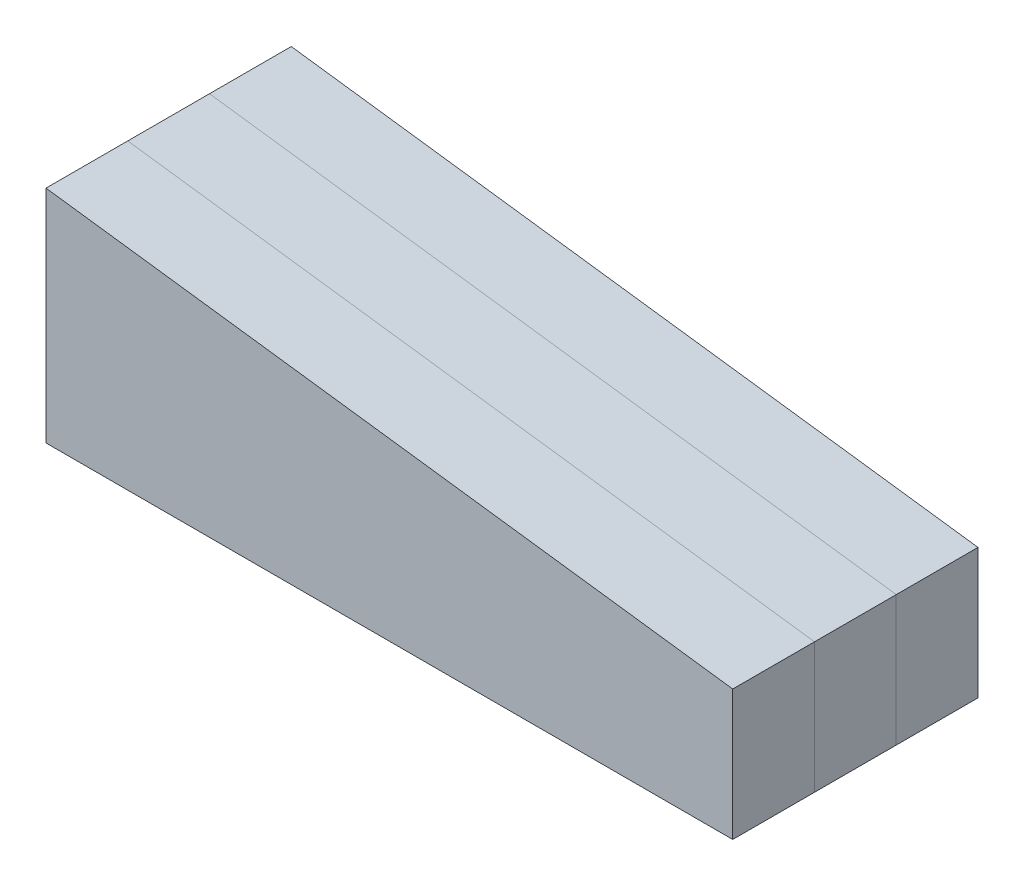
ISO-10303-21;
HEADER;
FILE_DESCRIPTION(('STEP AP214'),'2;1');
FILE_NAME('part.step','',(''),(''),'','','');
FILE_SCHEMA(('AUTOMOTIVE_DESIGN { 1 0 10303 214 1 1 1 1 }'));
ENDSEC;
DATA;
#1=APPLICATION_CONTEXT('core data for automotive mechanical design processes');
#2=APPLICATION_PROTOCOL_DEFINITION('international standard','automotive_design',2000,#1);
#3=PRODUCT_CONTEXT('',#1,'mechanical');
#4=PRODUCT('Part','Part','',(#3));
#5=PRODUCT_RELATED_PRODUCT_CATEGORY('part','',(#4));
#6=PRODUCT_DEFINITION_FORMATION('','',#4);
#7=PRODUCT_DEFINITION_CONTEXT('part definition',#1,'design');
#8=PRODUCT_DEFINITION('design','',#6,#7);
#9=PRODUCT_DEFINITION_SHAPE('','',#8);
#10=(LENGTH_UNIT() NAMED_UNIT(*) SI_UNIT(.MILLI.,.METRE.));
#11=(NAMED_UNIT(*) PLANE_ANGLE_UNIT() SI_UNIT($,.RADIAN.));
#12=(NAMED_UNIT(*) SI_UNIT($,.STERADIAN.) SOLID_ANGLE_UNIT());
#13=UNCERTAINTY_MEASURE_WITH_UNIT(LENGTH_MEASURE(1.E-05),#10,'distance_accuracy_value','');
#14=(GEOMETRIC_REPRESENTATION_CONTEXT(3) GLOBAL_UNCERTAINTY_ASSIGNED_CONTEXT((#13)) GLOBAL_UNIT_ASSIGNED_CONTEXT((#10,
#11,#12)) REPRESENTATION_CONTEXT('',''));
#15=CARTESIAN_POINT('',(0.,0.,0.));
#16=DIRECTION('',(0.,0.,1.));
#17=DIRECTION('',(1.,0.,0.));
#18=AXIS2_PLACEMENT_3D('',#15,#16,#17);
#19=CARTESIAN_POINT('',(0.,0.,26.4583333333333));
#20=DIRECTION('',(0.,1.,0.));
#21=DIRECTION('',(-1.,0.,0.));
#22=AXIS2_PLACEMENT_3D('',#19,#20,#21);
#23=PLANE('',#22);
#24=DIRECTION('',(1.,0.,0.));
#25=VECTOR('',#24,1.);
#26=CARTESIAN_POINT('',(0.,0.,15.875));
#27=LINE('',#26,#25);
#28=CARTESIAN_POINT('',(0.,0.,15.875));
#29=VERTEX_POINT('',#28);
#30=CARTESIAN_POINT('',(88.9,0.,15.875));
#31=VERTEX_POINT('',#30);
#32=EDGE_CURVE('E113',#29,#31,#27,.T.);
#33=ORIENTED_EDGE('',*,*,#32,.T.);
#34=DIRECTION('',(0.,0.,-1.));
#35=VECTOR('',#34,1.);
#36=CARTESIAN_POINT('',(88.9,0.,26.4583333333333));
#37=LINE('',#36,#35);
#38=CARTESIAN_POINT('',(88.9,0.,26.4583333333333));
#39=VERTEX_POINT('',#38);
#40=EDGE_CURVE('E12',#39,#31,#37,.T.);
#41=ORIENTED_EDGE('',*,*,#40,.F.);
#42=DIRECTION('',(1.,0.,0.));
#43=VECTOR('',#42,1.);
#44=CARTESIAN_POINT('',(0.,0.,26.4583333333333));
#45=LINE('',#44,#43);
#46=CARTESIAN_POINT('',(0.,0.,26.4583333333333));
#47=VERTEX_POINT('',#46);
#48=EDGE_CURVE('E100',#47,#39,#45,.T.);
#49=ORIENTED_EDGE('',*,*,#48,.F.);
#50=DIRECTION('',(0.,0.,-1.));
#51=VECTOR('',#50,1.);
#52=CARTESIAN_POINT('',(0.,0.,26.4583333333333));
#53=LINE('',#52,#51);
#54=EDGE_CURVE('E109',#47,#29,#53,.T.);
#55=ORIENTED_EDGE('',*,*,#54,.T.);
#56=EDGE_LOOP('',(#33,#41,#49,#55));
#57=FACE_BOUND('',#56,.T.);
#58=ADVANCED_FACE('F48',(#57),#23,.F.);
#59=CARTESIAN_POINT('',(88.9,0.,26.4583333333333));
#60=DIRECTION('',(-1.,0.,0.));
#61=DIRECTION('',(0.,0.,1.));
#62=AXIS2_PLACEMENT_3D('',#59,#60,#61);
#63=PLANE('',#62);
#64=DIRECTION('',(0.,1.,0.));
#65=VECTOR('',#64,1.);
#66=CARTESIAN_POINT('',(88.9,0.,15.875));
#67=LINE('',#66,#65);
#68=CARTESIAN_POINT('',(88.9,16.8710929644812,15.875));
#69=VERTEX_POINT('',#68);
#70=EDGE_CURVE('E104',#31,#69,#67,.T.);
#71=ORIENTED_EDGE('',*,*,#70,.T.);
#72=DIRECTION('',(0.,0.,-1.));
#73=VECTOR('',#72,1.);
#74=CARTESIAN_POINT('',(88.9,16.8710929644812,26.4583333333333));
#75=LINE('',#74,#73);
#76=CARTESIAN_POINT('',(88.9,16.8710929644812,26.4583333333333));
#77=VERTEX_POINT('',#76);
#78=EDGE_CURVE('E57',#77,#69,#75,.T.);
#79=ORIENTED_EDGE('',*,*,#78,.F.);
#80=DIRECTION('',(0.,1.,0.));
#81=VECTOR('',#80,1.);
#82=CARTESIAN_POINT('',(88.9,0.,26.4583333333333));
#83=LINE('',#82,#81);
#84=EDGE_CURVE('E95',#39,#77,#83,.T.);
#85=ORIENTED_EDGE('',*,*,#84,.F.);
#86=ORIENTED_EDGE('',*,*,#40,.T.);
#87=EDGE_LOOP('',(#71,#79,#85,#86));
#88=FACE_BOUND('',#87,.T.);
#89=ADVANCED_FACE('F103',(#88),#63,.F.);
#90=CARTESIAN_POINT('',(88.9,16.8710929644812,26.4583333333333));
#91=DIRECTION('',(-0.130526192220044,-0.991444861373811,0.));
#92=DIRECTION('',(0.991444861373811,-0.130526192220044,0.));
#93=AXIS2_PLACEMENT_3D('',#90,#91,#92);
#94=PLANE('',#93);
#95=DIRECTION('',(-0.991444861373811,0.130526192220044,0.));
#96=VECTOR('',#95,1.);
#97=CARTESIAN_POINT('',(88.9,16.8710929644812,15.875));
#98=LINE('',#97,#96);
#99=CARTESIAN_POINT('',(0.,28.575,15.875));
#100=VERTEX_POINT('',#99);
#101=EDGE_CURVE('E82',#69,#100,#98,.T.);
#102=ORIENTED_EDGE('',*,*,#101,.T.);
#103=DIRECTION('',(0.,0.,-1.));
#104=VECTOR('',#103,1.);
#105=CARTESIAN_POINT('',(0.,28.575,26.4583333333333));
#106=LINE('',#105,#104);
#107=CARTESIAN_POINT('',(0.,28.575,26.4583333333333));
#108=VERTEX_POINT('',#107);
#109=EDGE_CURVE('E105',#108,#100,#106,.T.);
#110=ORIENTED_EDGE('',*,*,#109,.F.);
#111=DIRECTION('',(-0.991444861373811,0.130526192220044,0.));
#112=VECTOR('',#111,1.);
#113=CARTESIAN_POINT('',(88.9,16.8710929644812,26.4583333333333));
#114=LINE('',#113,#112);
#115=EDGE_CURVE('E98',#77,#108,#114,.T.);
#116=ORIENTED_EDGE('',*,*,#115,.F.);
#117=ORIENTED_EDGE('',*,*,#78,.T.);
#118=EDGE_LOOP('',(#102,#110,#116,#117));
#119=FACE_BOUND('',#118,.T.);
#120=ADVANCED_FACE('F106',(#119),#94,.F.);
#121=CARTESIAN_POINT('',(0.,28.575,26.4583333333333));
#122=DIRECTION('',(1.,0.,0.));
#123=DIRECTION('',(0.,0.,-1.));
#124=AXIS2_PLACEMENT_3D('',#121,#122,#123);
#125=PLANE('',#124);
#126=DIRECTION('',(0.,-1.,0.));
#127=VECTOR('',#126,1.);
#128=CARTESIAN_POINT('',(0.,28.575,15.875));
#129=LINE('',#128,#127);
#130=EDGE_CURVE('E88',#100,#29,#129,.T.);
#131=ORIENTED_EDGE('',*,*,#130,.T.);
#132=ORIENTED_EDGE('',*,*,#54,.F.);
#133=DIRECTION('',(0.,-1.,0.));
#134=VECTOR('',#133,1.);
#135=CARTESIAN_POINT('',(0.,28.575,26.4583333333333));
#136=LINE('',#135,#134);
#137=EDGE_CURVE('E65',#108,#47,#136,.T.);
#138=ORIENTED_EDGE('',*,*,#137,.F.);
#139=ORIENTED_EDGE('',*,*,#109,.T.);
#140=EDGE_LOOP('',(#131,#132,#138,#139));
#141=FACE_BOUND('',#140,.T.);
#142=ADVANCED_FACE('F124',(#141),#125,.F.);
#143=CARTESIAN_POINT('',(0.,0.,26.4583333333333));
#144=DIRECTION('',(0.,0.,1.));
#145=DIRECTION('',(1.,0.,0.));
#146=AXIS2_PLACEMENT_3D('',#143,#144,#145);
#147=PLANE('',#146);
#148=ORIENTED_EDGE('',*,*,#48,.T.);
#149=ORIENTED_EDGE('',*,*,#84,.T.);
#150=ORIENTED_EDGE('',*,*,#115,.T.);
#151=ORIENTED_EDGE('',*,*,#137,.T.);
#152=EDGE_LOOP('',(#148,#149,#150,#151));
#153=FACE_BOUND('',#152,.T.);
#154=ADVANCED_FACE('F96',(#153),#147,.T.);
#155=CARTESIAN_POINT('',(0.,0.,15.875));
#156=DIRECTION('',(0.,0.,1.));
#157=DIRECTION('',(1.,0.,0.));
#158=AXIS2_PLACEMENT_3D('',#155,#156,#157);
#159=PLANE('',#158);
#160=ORIENTED_EDGE('',*,*,#32,.F.);
#161=ORIENTED_EDGE('',*,*,#130,.F.);
#162=ORIENTED_EDGE('',*,*,#101,.F.);
#163=ORIENTED_EDGE('',*,*,#70,.F.);
#164=EDGE_LOOP('',(#160,#161,#162,#163));
#165=FACE_BOUND('',#164,.T.);
#166=ADVANCED_FACE('F127',(#165),#159,.F.);
#167=CLOSED_SHELL('',(#58,#89,#120,#142,#154,#166));
#168=MANIFOLD_SOLID_BREP('B2',#167);
#169=CARTESIAN_POINT('',(88.9,0.,15.875));
#170=DIRECTION('',(-1.,0.,0.));
#171=DIRECTION('',(0.,0.,1.));
#172=AXIS2_PLACEMENT_3D('',#169,#170,#171);
#173=PLANE('',#172);
#174=DIRECTION('',(0.,1.,0.));
#175=VECTOR('',#174,1.);
#176=CARTESIAN_POINT('',(88.9,0.,5.29166666666667));
#177=LINE('',#176,#175);
#178=CARTESIAN_POINT('',(88.9,0.,5.29166666666667));
#179=VERTEX_POINT('',#178);
#180=CARTESIAN_POINT('',(88.9,16.8710929644812,5.29166666666667));
#181=VERTEX_POINT('',#180);
#182=EDGE_CURVE('E256',#179,#181,#177,.T.);
#183=ORIENTED_EDGE('',*,*,#182,.T.);
#184=DIRECTION('',(0.,0.,-1.));
#185=VECTOR('',#184,1.);
#186=CARTESIAN_POINT('',(88.9,16.8710929644812,15.875));
#187=LINE('',#186,#185);
#188=CARTESIAN_POINT('',(88.9,16.8710929644812,15.875));
#189=VERTEX_POINT('',#188);
#190=EDGE_CURVE('E46',#189,#181,#187,.T.);
#191=ORIENTED_EDGE('',*,*,#190,.F.);
#192=DIRECTION('',(0.,1.,0.));
#193=VECTOR('',#192,1.);
#194=CARTESIAN_POINT('',(88.9,0.,15.875));
#195=LINE('',#194,#193);
#196=CARTESIAN_POINT('',(88.9,0.,15.875));
#197=VERTEX_POINT('',#196);
#198=EDGE_CURVE('E240',#197,#189,#195,.T.);
#199=ORIENTED_EDGE('',*,*,#198,.F.);
#200=DIRECTION('',(0.,0.,-1.));
#201=VECTOR('',#200,1.);
#202=CARTESIAN_POINT('',(88.9,0.,15.875));
#203=LINE('',#202,#201);
#204=EDGE_CURVE('E252',#197,#179,#203,.T.);
#205=ORIENTED_EDGE('',*,*,#204,.T.);
#206=EDGE_LOOP('',(#183,#191,#199,#205));
#207=FACE_BOUND('',#206,.T.);
#208=ADVANCED_FACE('F189',(#207),#173,.F.);
#209=CARTESIAN_POINT('',(88.9,16.8710929644812,15.875));
#210=DIRECTION('',(-0.130526192220044,-0.991444861373811,0.));
#211=DIRECTION('',(0.991444861373811,-0.130526192220044,0.));
#212=AXIS2_PLACEMENT_3D('',#209,#210,#211);
#213=PLANE('',#212);
#214=DIRECTION('',(-0.991444861373811,0.130526192220044,0.));
#215=VECTOR('',#214,1.);
#216=CARTESIAN_POINT('',(88.9,16.8710929644812,5.29166666666667));
#217=LINE('',#216,#215);
#218=CARTESIAN_POINT('',(0.,28.575,5.29166666666667));
#219=VERTEX_POINT('',#218);
#220=EDGE_CURVE('E245',#181,#219,#217,.T.);
#221=ORIENTED_EDGE('',*,*,#220,.T.);
#222=DIRECTION('',(0.,0.,-1.));
#223=VECTOR('',#222,1.);
#224=CARTESIAN_POINT('',(0.,28.575,15.875));
#225=LINE('',#224,#223);
#226=CARTESIAN_POINT('',(0.,28.575,15.875));
#227=VERTEX_POINT('',#226);
#228=EDGE_CURVE('E197',#227,#219,#225,.T.);
#229=ORIENTED_EDGE('',*,*,#228,.F.);
#230=DIRECTION('',(-0.991444861373811,0.130526192220044,0.));
#231=VECTOR('',#230,1.);
#232=CARTESIAN_POINT('',(88.9,16.8710929644812,15.875));
#233=LINE('',#232,#231);
#234=EDGE_CURVE('E235',#189,#227,#233,.T.);
#235=ORIENTED_EDGE('',*,*,#234,.F.);
#236=ORIENTED_EDGE('',*,*,#190,.T.);
#237=EDGE_LOOP('',(#221,#229,#235,#236));
#238=FACE_BOUND('',#237,.T.);
#239=ADVANCED_FACE('F244',(#238),#213,.F.);
#240=CARTESIAN_POINT('',(0.,28.575,15.875));
#241=DIRECTION('',(1.,0.,0.));
#242=DIRECTION('',(0.,0.,-1.));
#243=AXIS2_PLACEMENT_3D('',#240,#241,#242);
#244=PLANE('',#243);
#245=DIRECTION('',(0.,-1.,0.));
#246=VECTOR('',#245,1.);
#247=CARTESIAN_POINT('',(0.,28.575,5.29166666666667));
#248=LINE('',#247,#246);
#249=CARTESIAN_POINT('',(0.,0.,5.29166666666667));
#250=VERTEX_POINT('',#249);
#251=EDGE_CURVE('E222',#219,#250,#248,.T.);
#252=ORIENTED_EDGE('',*,*,#251,.T.);
#253=DIRECTION('',(0.,0.,-1.));
#254=VECTOR('',#253,1.);
#255=CARTESIAN_POINT('',(0.,0.,15.875));
#256=LINE('',#255,#254);
#257=CARTESIAN_POINT('',(0.,0.,15.875));
#258=VERTEX_POINT('',#257);
#259=EDGE_CURVE('E246',#258,#250,#256,.T.);
#260=ORIENTED_EDGE('',*,*,#259,.F.);
#261=DIRECTION('',(0.,-1.,0.));
#262=VECTOR('',#261,1.);
#263=CARTESIAN_POINT('',(0.,28.575,15.875));
#264=LINE('',#263,#262);
#265=EDGE_CURVE('E238',#227,#258,#264,.T.);
#266=ORIENTED_EDGE('',*,*,#265,.F.);
#267=ORIENTED_EDGE('',*,*,#228,.T.);
#268=EDGE_LOOP('',(#252,#260,#266,#267));
#269=FACE_BOUND('',#268,.T.);
#270=ADVANCED_FACE('F247',(#269),#244,.F.);
#271=CARTESIAN_POINT('',(0.,0.,15.875));
#272=DIRECTION('',(0.,1.,0.));
#273=DIRECTION('',(-1.,0.,0.));
#274=AXIS2_PLACEMENT_3D('',#271,#272,#273);
#275=PLANE('',#274);
#276=DIRECTION('',(1.,0.,0.));
#277=VECTOR('',#276,1.);
#278=CARTESIAN_POINT('',(0.,0.,5.29166666666667));
#279=LINE('',#278,#277);
#280=EDGE_CURVE('E228',#250,#179,#279,.T.);
#281=ORIENTED_EDGE('',*,*,#280,.T.);
#282=ORIENTED_EDGE('',*,*,#204,.F.);
#283=DIRECTION('',(1.,0.,0.));
#284=VECTOR('',#283,1.);
#285=CARTESIAN_POINT('',(0.,0.,15.875));
#286=LINE('',#285,#284);
#287=EDGE_CURVE('E205',#258,#197,#286,.T.);
#288=ORIENTED_EDGE('',*,*,#287,.F.);
#289=ORIENTED_EDGE('',*,*,#259,.T.);
#290=EDGE_LOOP('',(#281,#282,#288,#289));
#291=FACE_BOUND('',#290,.T.);
#292=ADVANCED_FACE('F265',(#291),#275,.F.);
#293=CARTESIAN_POINT('',(0.,0.,15.875));
#294=DIRECTION('',(0.,0.,-1.));
#295=DIRECTION('',(-1.,0.,0.));
#296=AXIS2_PLACEMENT_3D('',#293,#294,#295);
#297=PLANE('',#296);
#298=ORIENTED_EDGE('',*,*,#198,.T.);
#299=ORIENTED_EDGE('',*,*,#234,.T.);
#300=ORIENTED_EDGE('',*,*,#265,.T.);
#301=ORIENTED_EDGE('',*,*,#287,.T.);
#302=EDGE_LOOP('',(#298,#299,#300,#301));
#303=FACE_BOUND('',#302,.T.);
#304=ADVANCED_FACE('F236',(#303),#297,.F.);
#305=CARTESIAN_POINT('',(0.,0.,5.29166666666667));
#306=DIRECTION('',(0.,0.,-1.));
#307=DIRECTION('',(-1.,0.,0.));
#308=AXIS2_PLACEMENT_3D('',#305,#306,#307);
#309=PLANE('',#308);
#310=ORIENTED_EDGE('',*,*,#182,.F.);
#311=ORIENTED_EDGE('',*,*,#280,.F.);
#312=ORIENTED_EDGE('',*,*,#251,.F.);
#313=ORIENTED_EDGE('',*,*,#220,.F.);
#314=EDGE_LOOP('',(#310,#311,#312,#313));
#315=FACE_BOUND('',#314,.T.);
#316=ADVANCED_FACE('F268',(#315),#309,.T.);
#317=CLOSED_SHELL('',(#208,#239,#270,#292,#304,#316));
#318=MANIFOLD_SOLID_BREP('B6',#317);
#319=CARTESIAN_POINT('',(0.,28.575,5.29166666666667));
#320=DIRECTION('',(-0.130526192220044,-0.991444861373811,0.));
#321=DIRECTION('',(0.991444861373811,-0.130526192220044,0.));
#322=AXIS2_PLACEMENT_3D('',#319,#320,#321);
#323=PLANE('',#322);
#324=DIRECTION('',(-0.991444861373811,0.130526192220044,0.));
#325=VECTOR('',#324,1.);
#326=CARTESIAN_POINT('',(0.,28.575,-5.29166666666667));
#327=LINE('',#326,#325);
#328=CARTESIAN_POINT('',(88.9,16.8710929644812,-5.29166666666667));
#329=VERTEX_POINT('',#328);
#330=CARTESIAN_POINT('',(0.,28.575,-5.29166666666667));
#331=VERTEX_POINT('',#330);
#332=EDGE_CURVE('E383',#329,#331,#327,.T.);
#333=ORIENTED_EDGE('',*,*,#332,.T.);
#334=DIRECTION('',(0.,0.,-1.));
#335=VECTOR('',#334,1.);
#336=CARTESIAN_POINT('',(0.,28.575,5.29166666666667));
#337=LINE('',#336,#335);
#338=CARTESIAN_POINT('',(0.,28.575,5.29166666666667));
#339=VERTEX_POINT('',#338);
#340=EDGE_CURVE('E187',#339,#331,#337,.T.);
#341=ORIENTED_EDGE('',*,*,#340,.F.);
#342=DIRECTION('',(-0.991444861373811,0.130526192220044,0.));
#343=VECTOR('',#342,1.);
#344=CARTESIAN_POINT('',(0.,28.575,5.29166666666667));
#345=LINE('',#344,#343);
#346=CARTESIAN_POINT('',(88.9,16.8710929644812,5.29166666666667));
#347=VERTEX_POINT('',#346);
#348=EDGE_CURVE('E369',#347,#339,#345,.T.);
#349=ORIENTED_EDGE('',*,*,#348,.F.);
#350=DIRECTION('',(0.,0.,-1.));
#351=VECTOR('',#350,1.);
#352=CARTESIAN_POINT('',(88.9,16.8710929644812,5.29166666666667));
#353=LINE('',#352,#351);
#354=EDGE_CURVE('E379',#347,#329,#353,.T.);
#355=ORIENTED_EDGE('',*,*,#354,.T.);
#356=EDGE_LOOP('',(#333,#341,#349,#355));
#357=FACE_BOUND('',#356,.T.);
#358=ADVANCED_FACE('F317',(#357),#323,.F.);
#359=CARTESIAN_POINT('',(0.,0.,5.29166666666667));
#360=DIRECTION('',(1.,0.,0.));
#361=DIRECTION('',(0.,0.,-1.));
#362=AXIS2_PLACEMENT_3D('',#359,#360,#361);
#363=PLANE('',#362);
#364=DIRECTION('',(0.,-1.,0.));
#365=VECTOR('',#364,1.);
#366=CARTESIAN_POINT('',(0.,0.,-5.29166666666667));
#367=LINE('',#366,#365);
#368=CARTESIAN_POINT('',(0.,0.,-5.29166666666667));
#369=VERTEX_POINT('',#368);
#370=EDGE_CURVE('E374',#331,#369,#367,.T.);
#371=ORIENTED_EDGE('',*,*,#370,.T.);
#372=DIRECTION('',(0.,0.,-1.));
#373=VECTOR('',#372,1.);
#374=CARTESIAN_POINT('',(0.,0.,5.29166666666667));
#375=LINE('',#374,#373);
#376=CARTESIAN_POINT('',(0.,0.,5.29166666666667));
#377=VERTEX_POINT('',#376);
#378=EDGE_CURVE('E326',#377,#369,#375,.T.);
#379=ORIENTED_EDGE('',*,*,#378,.F.);
#380=DIRECTION('',(0.,-1.,0.));
#381=VECTOR('',#380,1.);
#382=CARTESIAN_POINT('',(0.,0.,5.29166666666667));
#383=LINE('',#382,#381);
#384=EDGE_CURVE('E364',#339,#377,#383,.T.);
#385=ORIENTED_EDGE('',*,*,#384,.F.);
#386=ORIENTED_EDGE('',*,*,#340,.T.);
#387=EDGE_LOOP('',(#371,#379,#385,#386));
#388=FACE_BOUND('',#387,.T.);
#389=ADVANCED_FACE('F373',(#388),#363,.F.);
#390=CARTESIAN_POINT('',(88.9,0.,5.29166666666667));
#391=DIRECTION('',(0.,1.,0.));
#392=DIRECTION('',(-1.,0.,0.));
#393=AXIS2_PLACEMENT_3D('',#390,#391,#392);
#394=PLANE('',#393);
#395=DIRECTION('',(1.,0.,0.));
#396=VECTOR('',#395,1.);
#397=CARTESIAN_POINT('',(88.9,0.,-5.29166666666667));
#398=LINE('',#397,#396);
#399=CARTESIAN_POINT('',(88.9,0.,-5.29166666666667));
#400=VERTEX_POINT('',#399);
#401=EDGE_CURVE('E351',#369,#400,#398,.T.);
#402=ORIENTED_EDGE('',*,*,#401,.T.);
#403=DIRECTION('',(0.,0.,-1.));
#404=VECTOR('',#403,1.);
#405=CARTESIAN_POINT('',(88.9,0.,5.29166666666667));
#406=LINE('',#405,#404);
#407=CARTESIAN_POINT('',(88.9,0.,5.29166666666667));
#408=VERTEX_POINT('',#407);
#409=EDGE_CURVE('E376',#408,#400,#406,.T.);
#410=ORIENTED_EDGE('',*,*,#409,.F.);
#411=DIRECTION('',(1.,0.,0.));
#412=VECTOR('',#411,1.);
#413=CARTESIAN_POINT('',(88.9,0.,5.29166666666667));
#414=LINE('',#413,#412);
#415=EDGE_CURVE('E367',#377,#408,#414,.T.);
#416=ORIENTED_EDGE('',*,*,#415,.F.);
#417=ORIENTED_EDGE('',*,*,#378,.T.);
#418=EDGE_LOOP('',(#402,#410,#416,#417));
#419=FACE_BOUND('',#418,.T.);
#420=ADVANCED_FACE('F377',(#419),#394,.F.);
#421=CARTESIAN_POINT('',(88.9,16.8710929644812,5.29166666666667));
#422=DIRECTION('',(-1.,0.,0.));
#423=DIRECTION('',(0.,0.,1.));
#424=AXIS2_PLACEMENT_3D('',#421,#422,#423);
#425=PLANE('',#424);
#426=DIRECTION('',(0.,1.,0.));
#427=VECTOR('',#426,1.);
#428=CARTESIAN_POINT('',(88.9,16.8710929644812,-5.29166666666667));
#429=LINE('',#428,#427);
#430=EDGE_CURVE('E357',#400,#329,#429,.T.);
#431=ORIENTED_EDGE('',*,*,#430,.T.);
#432=ORIENTED_EDGE('',*,*,#354,.F.);
#433=DIRECTION('',(0.,1.,0.));
#434=VECTOR('',#433,1.);
#435=CARTESIAN_POINT('',(88.9,16.8710929644812,5.29166666666667));
#436=LINE('',#435,#434);
#437=EDGE_CURVE('E334',#408,#347,#436,.T.);
#438=ORIENTED_EDGE('',*,*,#437,.F.);
#439=ORIENTED_EDGE('',*,*,#409,.T.);
#440=EDGE_LOOP('',(#431,#432,#438,#439));
#441=FACE_BOUND('',#440,.T.);
#442=ADVANCED_FACE('F399',(#441),#425,.F.);
#443=CARTESIAN_POINT('',(0.,0.,5.29166666666667));
#444=DIRECTION('',(0.,0.,-1.));
#445=DIRECTION('',(-1.,0.,0.));
#446=AXIS2_PLACEMENT_3D('',#443,#444,#445);
#447=PLANE('',#446);
#448=ORIENTED_EDGE('',*,*,#348,.T.);
#449=ORIENTED_EDGE('',*,*,#384,.T.);
#450=ORIENTED_EDGE('',*,*,#415,.T.);
#451=ORIENTED_EDGE('',*,*,#437,.T.);
#452=EDGE_LOOP('',(#448,#449,#450,#451));
#453=FACE_BOUND('',#452,.T.);
#454=ADVANCED_FACE('F365',(#453),#447,.F.);
#455=CARTESIAN_POINT('',(0.,0.,-5.29166666666667));
#456=DIRECTION('',(0.,0.,-1.));
#457=DIRECTION('',(-1.,0.,0.));
#458=AXIS2_PLACEMENT_3D('',#455,#456,#457);
#459=PLANE('',#458);
#460=ORIENTED_EDGE('',*,*,#332,.F.);
#461=ORIENTED_EDGE('',*,*,#430,.F.);
#462=ORIENTED_EDGE('',*,*,#401,.F.);
#463=ORIENTED_EDGE('',*,*,#370,.F.);
#464=EDGE_LOOP('',(#460,#461,#462,#463));
#465=FACE_BOUND('',#464,.T.);
#466=ADVANCED_FACE('F402',(#465),#459,.T.);
#467=CLOSED_SHELL('',(#358,#389,#420,#442,#454,#466));
#468=MANIFOLD_SOLID_BREP('B40',#467);
#469=ADVANCED_BREP_SHAPE_REPRESENTATION('',(#18,#168,#318,#468),#14);
#470=SHAPE_DEFINITION_REPRESENTATION(#9,#469);
ENDSEC;
END-ISO-10303-21;
